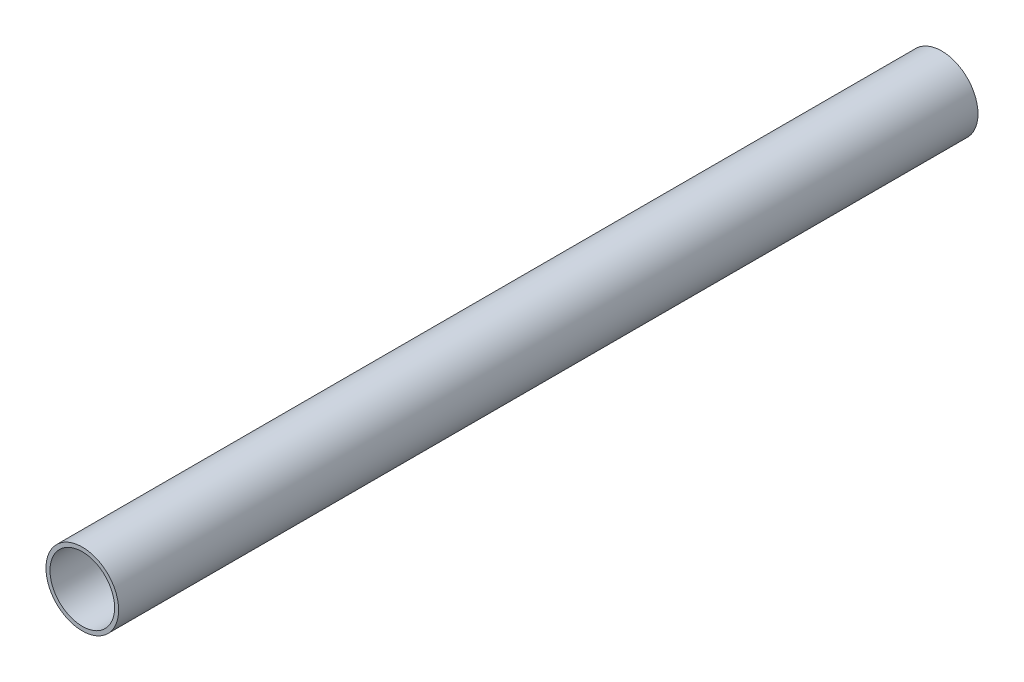
ISO-10303-21;
HEADER;
FILE_DESCRIPTION(('STEP AP214'),'2;1');
FILE_NAME('part.step','',(''),(''),'','','');
FILE_SCHEMA(('AUTOMOTIVE_DESIGN { 1 0 10303 214 1 1 1 1 }'));
ENDSEC;
DATA;
#1=APPLICATION_CONTEXT('core data for automotive mechanical design processes');
#2=APPLICATION_PROTOCOL_DEFINITION('international standard','automotive_design',2000,#1);
#3=PRODUCT_CONTEXT('',#1,'mechanical');
#4=PRODUCT('Part','Part','',(#3));
#5=PRODUCT_RELATED_PRODUCT_CATEGORY('part','',(#4));
#6=PRODUCT_DEFINITION_FORMATION('','',#4);
#7=PRODUCT_DEFINITION_CONTEXT('part definition',#1,'design');
#8=PRODUCT_DEFINITION('design','',#6,#7);
#9=PRODUCT_DEFINITION_SHAPE('','',#8);
#10=(LENGTH_UNIT() NAMED_UNIT(*) SI_UNIT(.MILLI.,.METRE.));
#11=(NAMED_UNIT(*) PLANE_ANGLE_UNIT() SI_UNIT($,.RADIAN.));
#12=(NAMED_UNIT(*) SI_UNIT($,.STERADIAN.) SOLID_ANGLE_UNIT());
#13=UNCERTAINTY_MEASURE_WITH_UNIT(LENGTH_MEASURE(1.E-05),#10,'distance_accuracy_value','');
#14=(GEOMETRIC_REPRESENTATION_CONTEXT(3) GLOBAL_UNCERTAINTY_ASSIGNED_CONTEXT((#13)) GLOBAL_UNIT_ASSIGNED_CONTEXT((#10,
#11,#12)) REPRESENTATION_CONTEXT('',''));
#15=CARTESIAN_POINT('',(0.,0.,0.));
#16=DIRECTION('',(0.,0.,1.));
#17=DIRECTION('',(1.,0.,0.));
#18=AXIS2_PLACEMENT_3D('',#15,#16,#17);
#19=CARTESIAN_POINT('',(0.,0.,-265.8735));
#20=DIRECTION('',(0.,0.,1.));
#21=DIRECTION('',(1.,0.,0.));
#22=AXIS2_PLACEMENT_3D('',#19,#20,#21);
#23=CYLINDRICAL_SURFACE('',#22,20.);
#24=CARTESIAN_POINT('',(0.,0.,265.8735));
#25=DIRECTION('',(0.,0.,1.));
#26=DIRECTION('',(1.,0.,0.));
#27=AXIS2_PLACEMENT_3D('',#24,#25,#26);
#28=CIRCLE('',#27,20.);
#29=CARTESIAN_POINT('',(20.,0.,265.8735));
#30=VERTEX_POINT('',#29);
#31=EDGE_CURVE('E18',#30,#30,#28,.F.);
#32=ORIENTED_EDGE('',*,*,#31,.F.);
#33=EDGE_LOOP('',(#32));
#34=FACE_BOUND('',#33,.T.);
#35=CARTESIAN_POINT('',(0.,0.,-265.8735));
#36=DIRECTION('',(0.,0.,1.));
#37=DIRECTION('',(1.,0.,0.));
#38=AXIS2_PLACEMENT_3D('',#35,#36,#37);
#39=CIRCLE('',#38,20.);
#40=CARTESIAN_POINT('',(20.,0.,-265.8735));
#41=VERTEX_POINT('',#40);
#42=EDGE_CURVE('E27',#41,#41,#39,.F.);
#43=ORIENTED_EDGE('',*,*,#42,.T.);
#44=EDGE_LOOP('',(#43));
#45=FACE_BOUND('',#44,.T.);
#46=ADVANCED_FACE('F15',(#34,#45),#23,.F.);
#47=CARTESIAN_POINT('',(0.,0.,265.8735));
#48=DIRECTION('',(0.,0.,1.));
#49=DIRECTION('',(1.,0.,0.));
#50=AXIS2_PLACEMENT_3D('',#47,#48,#49);
#51=PLANE('',#50);
#52=ORIENTED_EDGE('',*,*,#31,.T.);
#53=EDGE_LOOP('',(#52));
#54=FACE_BOUND('',#53,.T.);
#55=CARTESIAN_POINT('',(0.,0.,265.8735));
#56=DIRECTION('',(0.,0.,1.));
#57=DIRECTION('',(1.,0.,0.));
#58=AXIS2_PLACEMENT_3D('',#55,#56,#57);
#59=CIRCLE('',#58,22.5);
#60=CARTESIAN_POINT('',(22.5,0.,265.8735));
#61=VERTEX_POINT('',#60);
#62=EDGE_CURVE('E22',#61,#61,#59,.F.);
#63=ORIENTED_EDGE('',*,*,#62,.F.);
#64=EDGE_LOOP('',(#63));
#65=FACE_BOUND('',#64,.T.);
#66=ADVANCED_FACE('F35',(#54,#65),#51,.T.);
#67=CARTESIAN_POINT('',(0.,0.,-265.8735));
#68=DIRECTION('',(0.,0.,1.));
#69=DIRECTION('',(1.,0.,0.));
#70=AXIS2_PLACEMENT_3D('',#67,#68,#69);
#71=PLANE('',#70);
#72=ORIENTED_EDGE('',*,*,#42,.F.);
#73=EDGE_LOOP('',(#72));
#74=FACE_BOUND('',#73,.T.);
#75=CARTESIAN_POINT('',(0.,0.,-265.8735));
#76=DIRECTION('',(0.,0.,1.));
#77=DIRECTION('',(1.,0.,0.));
#78=AXIS2_PLACEMENT_3D('',#75,#76,#77);
#79=CIRCLE('',#78,22.5);
#80=CARTESIAN_POINT('',(22.5,0.,-265.8735));
#81=VERTEX_POINT('',#80);
#82=EDGE_CURVE('E10',#81,#81,#79,.T.);
#83=ORIENTED_EDGE('',*,*,#82,.F.);
#84=EDGE_LOOP('',(#83));
#85=FACE_BOUND('',#84,.T.);
#86=ADVANCED_FACE('F43',(#74,#85),#71,.F.);
#87=CARTESIAN_POINT('',(0.,0.,-265.8735));
#88=DIRECTION('',(0.,0.,1.));
#89=DIRECTION('',(1.,0.,0.));
#90=AXIS2_PLACEMENT_3D('',#87,#88,#89);
#91=CYLINDRICAL_SURFACE('',#90,22.5);
#92=ORIENTED_EDGE('',*,*,#62,.T.);
#93=EDGE_LOOP('',(#92));
#94=FACE_BOUND('',#93,.T.);
#95=ORIENTED_EDGE('',*,*,#82,.T.);
#96=EDGE_LOOP('',(#95));
#97=FACE_BOUND('',#96,.T.);
#98=ADVANCED_FACE('F44',(#94,#97),#91,.T.);
#99=CLOSED_SHELL('',(#46,#66,#86,#98));
#100=MANIFOLD_SOLID_BREP('B1',#99);
#101=ADVANCED_BREP_SHAPE_REPRESENTATION('',(#18,#100),#14);
#102=SHAPE_DEFINITION_REPRESENTATION(#9,#101);
ENDSEC;
END-ISO-10303-21;
